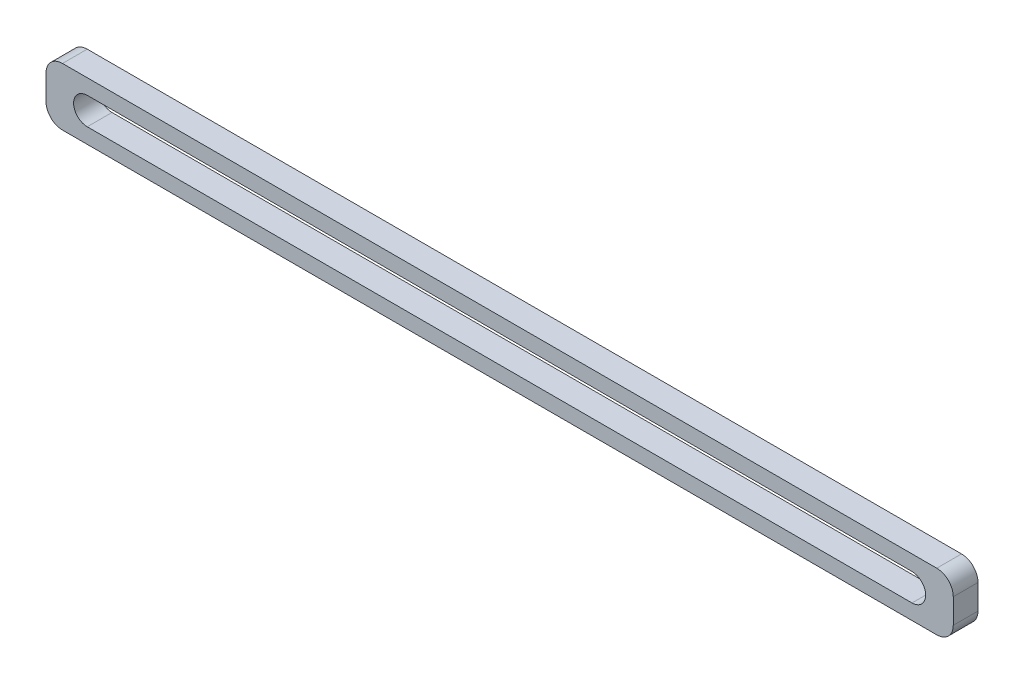
ISO-10303-21;
HEADER;
FILE_DESCRIPTION(('STEP AP214'),'2;1');
FILE_NAME('part.step','',(''),(''),'','','');
FILE_SCHEMA(('AUTOMOTIVE_DESIGN { 1 0 10303 214 1 1 1 1 }'));
ENDSEC;
DATA;
#1=APPLICATION_CONTEXT('core data for automotive mechanical design processes');
#2=APPLICATION_PROTOCOL_DEFINITION('international standard','automotive_design',2000,#1);
#3=PRODUCT_CONTEXT('',#1,'mechanical');
#4=PRODUCT('Part','Part','',(#3));
#5=PRODUCT_RELATED_PRODUCT_CATEGORY('part','',(#4));
#6=PRODUCT_DEFINITION_FORMATION('','',#4);
#7=PRODUCT_DEFINITION_CONTEXT('part definition',#1,'design');
#8=PRODUCT_DEFINITION('design','',#6,#7);
#9=PRODUCT_DEFINITION_SHAPE('','',#8);
#10=(LENGTH_UNIT() NAMED_UNIT(*) SI_UNIT(.MILLI.,.METRE.));
#11=(NAMED_UNIT(*) PLANE_ANGLE_UNIT() SI_UNIT($,.RADIAN.));
#12=(NAMED_UNIT(*) SI_UNIT($,.STERADIAN.) SOLID_ANGLE_UNIT());
#13=UNCERTAINTY_MEASURE_WITH_UNIT(LENGTH_MEASURE(1.E-05),#10,'distance_accuracy_value','');
#14=(GEOMETRIC_REPRESENTATION_CONTEXT(3) GLOBAL_UNCERTAINTY_ASSIGNED_CONTEXT((#13)) GLOBAL_UNIT_ASSIGNED_CONTEXT((#10,
#11,#12)) REPRESENTATION_CONTEXT('',''));
#15=CARTESIAN_POINT('',(0.,0.,0.));
#16=DIRECTION('',(0.,0.,1.));
#17=DIRECTION('',(1.,0.,0.));
#18=AXIS2_PLACEMENT_3D('',#15,#16,#17);
#19=CARTESIAN_POINT('',(0.,0.,3.));
#20=DIRECTION('',(0.,0.,1.));
#21=DIRECTION('',(1.,0.,0.));
#22=AXIS2_PLACEMENT_3D('',#19,#20,#21);
#23=PLANE('',#22);
#24=DIRECTION('',(-1.,0.,0.));
#25=VECTOR('',#24,1.);
#26=CARTESIAN_POINT('',(-55.,3.5,3.));
#27=LINE('',#26,#25);
#28=CARTESIAN_POINT('',(53.,3.5,3.));
#29=VERTEX_POINT('',#28);
#30=CARTESIAN_POINT('',(-53.,3.5,3.));
#31=VERTEX_POINT('',#30);
#32=EDGE_CURVE('E189',#29,#31,#27,.T.);
#33=ORIENTED_EDGE('',*,*,#32,.T.);
#34=CARTESIAN_POINT('',(-53.,1.5,3.));
#35=DIRECTION('',(0.,0.,1.));
#36=DIRECTION('',(1.,0.,0.));
#37=AXIS2_PLACEMENT_3D('',#34,#35,#36);
#38=CIRCLE('',#37,2.);
#39=CARTESIAN_POINT('',(-55.,1.5,3.));
#40=VERTEX_POINT('',#39);
#41=EDGE_CURVE('E247',#31,#40,#38,.T.);
#42=ORIENTED_EDGE('',*,*,#41,.T.);
#43=DIRECTION('',(0.,-1.,0.));
#44=VECTOR('',#43,1.);
#45=CARTESIAN_POINT('',(-55.,3.5,3.));
#46=LINE('',#45,#44);
#47=CARTESIAN_POINT('',(-55.,-1.5,3.));
#48=VERTEX_POINT('',#47);
#49=EDGE_CURVE('E194',#40,#48,#46,.T.);
#50=ORIENTED_EDGE('',*,*,#49,.T.);
#51=CARTESIAN_POINT('',(-53.,-1.5,3.));
#52=DIRECTION('',(0.,0.,1.));
#53=DIRECTION('',(1.,0.,0.));
#54=AXIS2_PLACEMENT_3D('',#51,#52,#53);
#55=CIRCLE('',#54,2.);
#56=CARTESIAN_POINT('',(-53.,-3.5,3.));
#57=VERTEX_POINT('',#56);
#58=EDGE_CURVE('E62',#48,#57,#55,.T.);
#59=ORIENTED_EDGE('',*,*,#58,.T.);
#60=DIRECTION('',(1.,0.,0.));
#61=VECTOR('',#60,1.);
#62=CARTESIAN_POINT('',(-55.,-3.5,3.));
#63=LINE('',#62,#61);
#64=CARTESIAN_POINT('',(53.,-3.5,3.));
#65=VERTEX_POINT('',#64);
#66=EDGE_CURVE('E197',#57,#65,#63,.T.);
#67=ORIENTED_EDGE('',*,*,#66,.T.);
#68=CARTESIAN_POINT('',(53.,-1.5,3.));
#69=DIRECTION('',(0.,0.,1.));
#70=DIRECTION('',(1.,0.,0.));
#71=AXIS2_PLACEMENT_3D('',#68,#69,#70);
#72=CIRCLE('',#71,2.);
#73=CARTESIAN_POINT('',(55.,-1.5,3.));
#74=VERTEX_POINT('',#73);
#75=EDGE_CURVE('E242',#65,#74,#72,.T.);
#76=ORIENTED_EDGE('',*,*,#75,.T.);
#77=DIRECTION('',(0.,1.,0.));
#78=VECTOR('',#77,1.);
#79=CARTESIAN_POINT('',(55.,3.5,3.));
#80=LINE('',#79,#78);
#81=CARTESIAN_POINT('',(55.,1.5,3.));
#82=VERTEX_POINT('',#81);
#83=EDGE_CURVE('E185',#74,#82,#80,.T.);
#84=ORIENTED_EDGE('',*,*,#83,.T.);
#85=CARTESIAN_POINT('',(53.,1.5,3.));
#86=DIRECTION('',(0.,0.,1.));
#87=DIRECTION('',(1.,0.,0.));
#88=AXIS2_PLACEMENT_3D('',#85,#86,#87);
#89=CIRCLE('',#88,2.);
#90=EDGE_CURVE('E239',#82,#29,#89,.T.);
#91=ORIENTED_EDGE('',*,*,#90,.T.);
#92=EDGE_LOOP('',(#33,#42,#50,#59,#67,#76,#84,#91));
#93=FACE_BOUND('',#92,.T.);
#94=DIRECTION('',(1.,0.,0.));
#95=VECTOR('',#94,1.);
#96=CARTESIAN_POINT('',(-50.,-1.65,3.));
#97=LINE('',#96,#95);
#98=CARTESIAN_POINT('',(-50.,-1.65,3.));
#99=VERTEX_POINT('',#98);
#100=CARTESIAN_POINT('',(50.,-1.65,3.));
#101=VERTEX_POINT('',#100);
#102=EDGE_CURVE('E143',#99,#101,#97,.T.);
#103=ORIENTED_EDGE('',*,*,#102,.F.);
#104=CARTESIAN_POINT('',(-50.,0.,3.));
#105=DIRECTION('',(0.,0.,1.));
#106=DIRECTION('',(1.,0.,0.));
#107=AXIS2_PLACEMENT_3D('',#104,#105,#106);
#108=CIRCLE('',#107,1.65);
#109=CARTESIAN_POINT('',(-50.,1.65,3.));
#110=VERTEX_POINT('',#109);
#111=EDGE_CURVE('E132',#110,#99,#108,.T.);
#112=ORIENTED_EDGE('',*,*,#111,.F.);
#113=DIRECTION('',(-1.,0.,0.));
#114=VECTOR('',#113,1.);
#115=CARTESIAN_POINT('',(-50.,1.65,3.));
#116=LINE('',#115,#114);
#117=CARTESIAN_POINT('',(50.,1.65000000000002,3.));
#118=VERTEX_POINT('',#117);
#119=EDGE_CURVE('E161',#118,#110,#116,.T.);
#120=ORIENTED_EDGE('',*,*,#119,.F.);
#121=CARTESIAN_POINT('',(50.,0.,3.));
#122=DIRECTION('',(0.,0.,1.));
#123=DIRECTION('',(1.,0.,0.));
#124=AXIS2_PLACEMENT_3D('',#121,#122,#123);
#125=CIRCLE('',#124,1.65);
#126=EDGE_CURVE('E157',#101,#118,#125,.T.);
#127=ORIENTED_EDGE('',*,*,#126,.F.);
#128=EDGE_LOOP('',(#103,#112,#120,#127));
#129=FACE_BOUND('',#128,.T.);
#130=ADVANCED_FACE('F39',(#93,#129),#23,.T.);
#131=CARTESIAN_POINT('',(0.,0.,0.));
#132=DIRECTION('',(0.,0.,1.));
#133=DIRECTION('',(1.,0.,0.));
#134=AXIS2_PLACEMENT_3D('',#131,#132,#133);
#135=PLANE('',#134);
#136=DIRECTION('',(0.,-1.,0.));
#137=VECTOR('',#136,1.);
#138=CARTESIAN_POINT('',(-55.,3.5,0.));
#139=LINE('',#138,#137);
#140=CARTESIAN_POINT('',(-55.,1.5,0.));
#141=VERTEX_POINT('',#140);
#142=CARTESIAN_POINT('',(-55.,-1.5,0.));
#143=VERTEX_POINT('',#142);
#144=EDGE_CURVE('E208',#141,#143,#139,.T.);
#145=ORIENTED_EDGE('',*,*,#144,.F.);
#146=CARTESIAN_POINT('',(-53.,1.5,0.));
#147=DIRECTION('',(0.,0.,1.));
#148=DIRECTION('',(1.,0.,0.));
#149=AXIS2_PLACEMENT_3D('',#146,#147,#148);
#150=CIRCLE('',#149,2.);
#151=CARTESIAN_POINT('',(-53.,3.5,0.));
#152=VERTEX_POINT('',#151);
#153=EDGE_CURVE('E229',#141,#152,#150,.F.);
#154=ORIENTED_EDGE('',*,*,#153,.T.);
#155=DIRECTION('',(-1.,0.,0.));
#156=VECTOR('',#155,1.);
#157=CARTESIAN_POINT('',(-55.,3.5,0.));
#158=LINE('',#157,#156);
#159=CARTESIAN_POINT('',(53.,3.5,0.));
#160=VERTEX_POINT('',#159);
#161=EDGE_CURVE('E204',#160,#152,#158,.T.);
#162=ORIENTED_EDGE('',*,*,#161,.F.);
#163=CARTESIAN_POINT('',(53.,1.5,0.));
#164=DIRECTION('',(0.,0.,1.));
#165=DIRECTION('',(1.,0.,0.));
#166=AXIS2_PLACEMENT_3D('',#163,#164,#165);
#167=CIRCLE('',#166,2.);
#168=CARTESIAN_POINT('',(55.,1.5,0.));
#169=VERTEX_POINT('',#168);
#170=EDGE_CURVE('E220',#160,#169,#167,.F.);
#171=ORIENTED_EDGE('',*,*,#170,.T.);
#172=DIRECTION('',(0.,1.,0.));
#173=VECTOR('',#172,1.);
#174=CARTESIAN_POINT('',(55.,3.5,0.));
#175=LINE('',#174,#173);
#176=CARTESIAN_POINT('',(55.,-1.5,0.));
#177=VERTEX_POINT('',#176);
#178=EDGE_CURVE('E152',#177,#169,#175,.T.);
#179=ORIENTED_EDGE('',*,*,#178,.F.);
#180=CARTESIAN_POINT('',(53.,-1.5,0.));
#181=DIRECTION('',(0.,0.,1.));
#182=DIRECTION('',(1.,0.,0.));
#183=AXIS2_PLACEMENT_3D('',#180,#181,#182);
#184=CIRCLE('',#183,2.);
#185=CARTESIAN_POINT('',(53.,-3.5,0.));
#186=VERTEX_POINT('',#185);
#187=EDGE_CURVE('E223',#177,#186,#184,.F.);
#188=ORIENTED_EDGE('',*,*,#187,.T.);
#189=DIRECTION('',(1.,0.,0.));
#190=VECTOR('',#189,1.);
#191=CARTESIAN_POINT('',(-55.,-3.5,0.));
#192=LINE('',#191,#190);
#193=CARTESIAN_POINT('',(-53.,-3.5,0.));
#194=VERTEX_POINT('',#193);
#195=EDGE_CURVE('E190',#194,#186,#192,.T.);
#196=ORIENTED_EDGE('',*,*,#195,.F.);
#197=CARTESIAN_POINT('',(-53.,-1.5,0.));
#198=DIRECTION('',(0.,0.,1.));
#199=DIRECTION('',(1.,0.,0.));
#200=AXIS2_PLACEMENT_3D('',#197,#198,#199);
#201=CIRCLE('',#200,2.);
#202=EDGE_CURVE('E226',#194,#143,#201,.F.);
#203=ORIENTED_EDGE('',*,*,#202,.T.);
#204=EDGE_LOOP('',(#145,#154,#162,#171,#179,#188,#196,#203));
#205=FACE_BOUND('',#204,.T.);
#206=CARTESIAN_POINT('',(-50.,0.,0.));
#207=DIRECTION('',(0.,0.,1.));
#208=DIRECTION('',(1.,0.,0.));
#209=AXIS2_PLACEMENT_3D('',#206,#207,#208);
#210=CIRCLE('',#209,1.65);
#211=CARTESIAN_POINT('',(-50.,1.65,0.));
#212=VERTEX_POINT('',#211);
#213=CARTESIAN_POINT('',(-50.,-1.65,0.));
#214=VERTEX_POINT('',#213);
#215=EDGE_CURVE('E166',#212,#214,#210,.T.);
#216=ORIENTED_EDGE('',*,*,#215,.T.);
#217=DIRECTION('',(1.,0.,0.));
#218=VECTOR('',#217,1.);
#219=CARTESIAN_POINT('',(-50.,-1.65,0.));
#220=LINE('',#219,#218);
#221=CARTESIAN_POINT('',(50.,-1.65,0.));
#222=VERTEX_POINT('',#221);
#223=EDGE_CURVE('E150',#214,#222,#220,.T.);
#224=ORIENTED_EDGE('',*,*,#223,.T.);
#225=CARTESIAN_POINT('',(50.,0.,0.));
#226=DIRECTION('',(0.,0.,1.));
#227=DIRECTION('',(1.,0.,0.));
#228=AXIS2_PLACEMENT_3D('',#225,#226,#227);
#229=CIRCLE('',#228,1.65);
#230=CARTESIAN_POINT('',(50.,1.65000000000002,0.));
#231=VERTEX_POINT('',#230);
#232=EDGE_CURVE('E171',#222,#231,#229,.T.);
#233=ORIENTED_EDGE('',*,*,#232,.T.);
#234=DIRECTION('',(-1.,0.,0.));
#235=VECTOR('',#234,1.);
#236=CARTESIAN_POINT('',(-50.,1.65,0.));
#237=LINE('',#236,#235);
#238=EDGE_CURVE('E144',#231,#212,#237,.T.);
#239=ORIENTED_EDGE('',*,*,#238,.T.);
#240=EDGE_LOOP('',(#216,#224,#233,#239));
#241=FACE_BOUND('',#240,.T.);
#242=ADVANCED_FACE('F273',(#205,#241),#135,.F.);
#243=CARTESIAN_POINT('',(55.,3.5,3.));
#244=DIRECTION('',(-1.,0.,0.));
#245=DIRECTION('',(0.,0.,1.));
#246=AXIS2_PLACEMENT_3D('',#243,#244,#245);
#247=PLANE('',#246);
#248=ORIENTED_EDGE('',*,*,#83,.F.);
#249=DIRECTION('',(0.,0.,-1.));
#250=VECTOR('',#249,1.);
#251=CARTESIAN_POINT('',(55.,-1.5,3.));
#252=LINE('',#251,#250);
#253=EDGE_CURVE('E11',#74,#177,#252,.T.);
#254=ORIENTED_EDGE('',*,*,#253,.T.);
#255=ORIENTED_EDGE('',*,*,#178,.T.);
#256=DIRECTION('',(0.,0.,-1.));
#257=VECTOR('',#256,1.);
#258=CARTESIAN_POINT('',(55.,1.5,3.));
#259=LINE('',#258,#257);
#260=EDGE_CURVE('E48',#169,#82,#259,.F.);
#261=ORIENTED_EDGE('',*,*,#260,.T.);
#262=EDGE_LOOP('',(#248,#254,#255,#261));
#263=FACE_BOUND('',#262,.T.);
#264=ADVANCED_FACE('F259',(#263),#247,.F.);
#265=CARTESIAN_POINT('',(-55.,3.5,3.));
#266=DIRECTION('',(0.,-1.,0.));
#267=DIRECTION('',(1.,0.,0.));
#268=AXIS2_PLACEMENT_3D('',#265,#266,#267);
#269=PLANE('',#268);
#270=ORIENTED_EDGE('',*,*,#161,.T.);
#271=DIRECTION('',(0.,0.,-1.));
#272=VECTOR('',#271,1.);
#273=CARTESIAN_POINT('',(-53.,3.5,3.));
#274=LINE('',#273,#272);
#275=EDGE_CURVE('E236',#152,#31,#274,.F.);
#276=ORIENTED_EDGE('',*,*,#275,.T.);
#277=ORIENTED_EDGE('',*,*,#32,.F.);
#278=DIRECTION('',(0.,0.,-1.));
#279=VECTOR('',#278,1.);
#280=CARTESIAN_POINT('',(53.,3.5,3.));
#281=LINE('',#280,#279);
#282=EDGE_CURVE('E232',#29,#160,#281,.T.);
#283=ORIENTED_EDGE('',*,*,#282,.T.);
#284=EDGE_LOOP('',(#270,#276,#277,#283));
#285=FACE_BOUND('',#284,.T.);
#286=ADVANCED_FACE('F269',(#285),#269,.F.);
#287=CARTESIAN_POINT('',(-55.,3.5,3.));
#288=DIRECTION('',(1.,0.,0.));
#289=DIRECTION('',(0.,0.,-1.));
#290=AXIS2_PLACEMENT_3D('',#287,#288,#289);
#291=PLANE('',#290);
#292=ORIENTED_EDGE('',*,*,#49,.F.);
#293=DIRECTION('',(0.,0.,-1.));
#294=VECTOR('',#293,1.);
#295=CARTESIAN_POINT('',(-55.,1.5,3.));
#296=LINE('',#295,#294);
#297=EDGE_CURVE('E216',#40,#141,#296,.T.);
#298=ORIENTED_EDGE('',*,*,#297,.T.);
#299=ORIENTED_EDGE('',*,*,#144,.T.);
#300=DIRECTION('',(0.,0.,-1.));
#301=VECTOR('',#300,1.);
#302=CARTESIAN_POINT('',(-55.,-1.5,3.));
#303=LINE('',#302,#301);
#304=EDGE_CURVE('E200',#143,#48,#303,.F.);
#305=ORIENTED_EDGE('',*,*,#304,.T.);
#306=EDGE_LOOP('',(#292,#298,#299,#305));
#307=FACE_BOUND('',#306,.T.);
#308=ADVANCED_FACE('F281',(#307),#291,.F.);
#309=CARTESIAN_POINT('',(-55.,-3.5,3.));
#310=DIRECTION('',(0.,1.,0.));
#311=DIRECTION('',(-1.,0.,0.));
#312=AXIS2_PLACEMENT_3D('',#309,#310,#311);
#313=PLANE('',#312);
#314=ORIENTED_EDGE('',*,*,#66,.F.);
#315=DIRECTION('',(0.,0.,-1.));
#316=VECTOR('',#315,1.);
#317=CARTESIAN_POINT('',(-53.,-3.5,3.));
#318=LINE('',#317,#316);
#319=EDGE_CURVE('E252',#57,#194,#318,.T.);
#320=ORIENTED_EDGE('',*,*,#319,.T.);
#321=ORIENTED_EDGE('',*,*,#195,.T.);
#322=DIRECTION('',(0.,0.,-1.));
#323=VECTOR('',#322,1.);
#324=CARTESIAN_POINT('',(53.,-3.5,3.));
#325=LINE('',#324,#323);
#326=EDGE_CURVE('E55',#186,#65,#325,.F.);
#327=ORIENTED_EDGE('',*,*,#326,.T.);
#328=EDGE_LOOP('',(#314,#320,#321,#327));
#329=FACE_BOUND('',#328,.T.);
#330=ADVANCED_FACE('F287',(#329),#313,.F.);
#331=CARTESIAN_POINT('',(-50.,0.,3.));
#332=DIRECTION('',(0.,0.,-1.));
#333=DIRECTION('',(-1.,0.,0.));
#334=AXIS2_PLACEMENT_3D('',#331,#332,#333);
#335=CYLINDRICAL_SURFACE('',#334,1.65);
#336=ORIENTED_EDGE('',*,*,#215,.F.);
#337=DIRECTION('',(0.,0.,-1.));
#338=VECTOR('',#337,1.);
#339=CARTESIAN_POINT('',(-50.,1.65,3.));
#340=LINE('',#339,#338);
#341=EDGE_CURVE('E138',#110,#212,#340,.T.);
#342=ORIENTED_EDGE('',*,*,#341,.F.);
#343=ORIENTED_EDGE('',*,*,#111,.T.);
#344=DIRECTION('',(0.,0.,-1.));
#345=VECTOR('',#344,1.);
#346=CARTESIAN_POINT('',(-50.,-1.65,3.));
#347=LINE('',#346,#345);
#348=EDGE_CURVE('E135',#99,#214,#347,.T.);
#349=ORIENTED_EDGE('',*,*,#348,.T.);
#350=EDGE_LOOP('',(#336,#342,#343,#349));
#351=FACE_BOUND('',#350,.T.);
#352=ADVANCED_FACE('F134',(#351),#335,.F.);
#353=CARTESIAN_POINT('',(-50.,-1.65,3.));
#354=DIRECTION('',(0.,1.,0.));
#355=DIRECTION('',(-1.,0.,0.));
#356=AXIS2_PLACEMENT_3D('',#353,#354,#355);
#357=PLANE('',#356);
#358=ORIENTED_EDGE('',*,*,#223,.F.);
#359=ORIENTED_EDGE('',*,*,#348,.F.);
#360=ORIENTED_EDGE('',*,*,#102,.T.);
#361=DIRECTION('',(0.,0.,-1.));
#362=VECTOR('',#361,1.);
#363=CARTESIAN_POINT('',(50.,-1.65,3.));
#364=LINE('',#363,#362);
#365=EDGE_CURVE('E153',#101,#222,#364,.T.);
#366=ORIENTED_EDGE('',*,*,#365,.T.);
#367=EDGE_LOOP('',(#358,#359,#360,#366));
#368=FACE_BOUND('',#367,.T.);
#369=ADVANCED_FACE('F147',(#368),#357,.T.);
#370=CARTESIAN_POINT('',(50.,0.,3.));
#371=DIRECTION('',(0.,0.,-1.));
#372=DIRECTION('',(-1.,0.,0.));
#373=AXIS2_PLACEMENT_3D('',#370,#371,#372);
#374=CYLINDRICAL_SURFACE('',#373,1.65);
#375=ORIENTED_EDGE('',*,*,#232,.F.);
#376=ORIENTED_EDGE('',*,*,#365,.F.);
#377=ORIENTED_EDGE('',*,*,#126,.T.);
#378=DIRECTION('',(0.,0.,-1.));
#379=VECTOR('',#378,1.);
#380=CARTESIAN_POINT('',(50.,1.65000000000002,3.));
#381=LINE('',#380,#379);
#382=EDGE_CURVE('E180',#118,#231,#381,.T.);
#383=ORIENTED_EDGE('',*,*,#382,.T.);
#384=EDGE_LOOP('',(#375,#376,#377,#383));
#385=FACE_BOUND('',#384,.T.);
#386=ADVANCED_FACE('F318',(#385),#374,.F.);
#387=CARTESIAN_POINT('',(-50.,1.65,3.));
#388=DIRECTION('',(0.,-1.,0.));
#389=DIRECTION('',(1.,0.,0.));
#390=AXIS2_PLACEMENT_3D('',#387,#388,#389);
#391=PLANE('',#390);
#392=ORIENTED_EDGE('',*,*,#238,.F.);
#393=ORIENTED_EDGE('',*,*,#382,.F.);
#394=ORIENTED_EDGE('',*,*,#119,.T.);
#395=ORIENTED_EDGE('',*,*,#341,.T.);
#396=EDGE_LOOP('',(#392,#393,#394,#395));
#397=FACE_BOUND('',#396,.T.);
#398=ADVANCED_FACE('F314',(#397),#391,.T.);
#399=CARTESIAN_POINT('',(-53.,1.5,3.));
#400=DIRECTION('',(0.,0.,-1.));
#401=DIRECTION('',(-1.,0.,0.));
#402=AXIS2_PLACEMENT_3D('',#399,#400,#401);
#403=CYLINDRICAL_SURFACE('',#402,2.);
#404=ORIENTED_EDGE('',*,*,#41,.F.);
#405=ORIENTED_EDGE('',*,*,#275,.F.);
#406=ORIENTED_EDGE('',*,*,#153,.F.);
#407=ORIENTED_EDGE('',*,*,#297,.F.);
#408=EDGE_LOOP('',(#404,#405,#406,#407));
#409=FACE_BOUND('',#408,.T.);
#410=ADVANCED_FACE('F278',(#409),#403,.T.);
#411=CARTESIAN_POINT('',(-53.,-1.5,3.));
#412=DIRECTION('',(0.,0.,-1.));
#413=DIRECTION('',(-1.,0.,0.));
#414=AXIS2_PLACEMENT_3D('',#411,#412,#413);
#415=CYLINDRICAL_SURFACE('',#414,2.);
#416=ORIENTED_EDGE('',*,*,#58,.F.);
#417=ORIENTED_EDGE('',*,*,#304,.F.);
#418=ORIENTED_EDGE('',*,*,#202,.F.);
#419=ORIENTED_EDGE('',*,*,#319,.F.);
#420=EDGE_LOOP('',(#416,#417,#418,#419));
#421=FACE_BOUND('',#420,.T.);
#422=ADVANCED_FACE('F285',(#421),#415,.T.);
#423=CARTESIAN_POINT('',(53.,-1.5,3.));
#424=DIRECTION('',(0.,0.,-1.));
#425=DIRECTION('',(-1.,0.,0.));
#426=AXIS2_PLACEMENT_3D('',#423,#424,#425);
#427=CYLINDRICAL_SURFACE('',#426,2.);
#428=ORIENTED_EDGE('',*,*,#75,.F.);
#429=ORIENTED_EDGE('',*,*,#326,.F.);
#430=ORIENTED_EDGE('',*,*,#187,.F.);
#431=ORIENTED_EDGE('',*,*,#253,.F.);
#432=EDGE_LOOP('',(#428,#429,#430,#431));
#433=FACE_BOUND('',#432,.T.);
#434=ADVANCED_FACE('F289',(#433),#427,.T.);
#435=CARTESIAN_POINT('',(53.,1.5,3.));
#436=DIRECTION('',(0.,0.,-1.));
#437=DIRECTION('',(-1.,0.,0.));
#438=AXIS2_PLACEMENT_3D('',#435,#436,#437);
#439=CYLINDRICAL_SURFACE('',#438,2.);
#440=ORIENTED_EDGE('',*,*,#90,.F.);
#441=ORIENTED_EDGE('',*,*,#260,.F.);
#442=ORIENTED_EDGE('',*,*,#170,.F.);
#443=ORIENTED_EDGE('',*,*,#282,.F.);
#444=EDGE_LOOP('',(#440,#441,#442,#443));
#445=FACE_BOUND('',#444,.T.);
#446=ADVANCED_FACE('F41',(#445),#439,.T.);
#447=CLOSED_SHELL('',(#130,#242,#264,#286,#308,#330,#352,#369,#386,#398,#410,#422,#434,#446));
#448=MANIFOLD_SOLID_BREP('B2',#447);
#449=ADVANCED_BREP_SHAPE_REPRESENTATION('',(#18,#448),#14);
#450=SHAPE_DEFINITION_REPRESENTATION(#9,#449);
ENDSEC;
END-ISO-10303-21;
